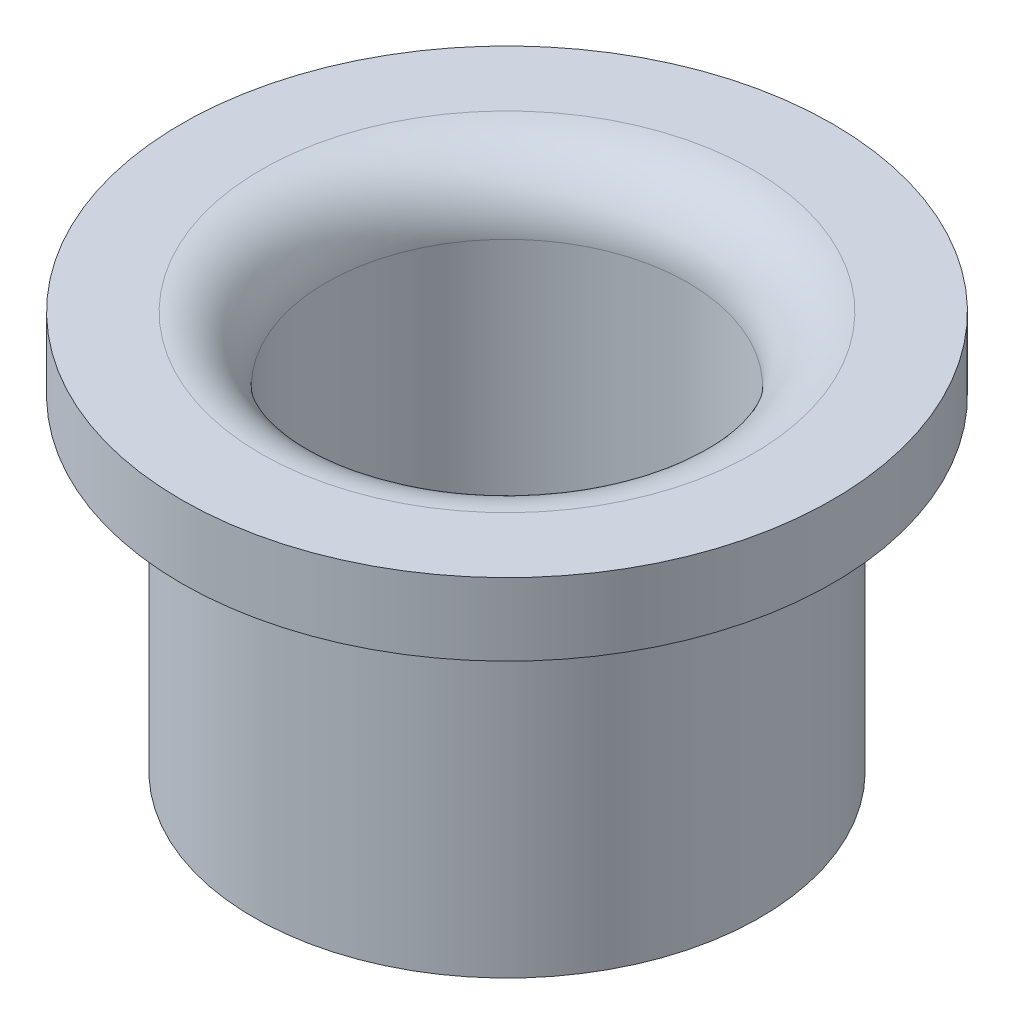
ISO-10303-21;
HEADER;
FILE_DESCRIPTION(('STEP AP214'),'2;1');
FILE_NAME('part.step','',(''),(''),'','','');
FILE_SCHEMA(('AUTOMOTIVE_DESIGN { 1 0 10303 214 1 1 1 1 }'));
ENDSEC;
DATA;
#1=APPLICATION_CONTEXT('core data for automotive mechanical design processes');
#2=APPLICATION_PROTOCOL_DEFINITION('international standard','automotive_design',2000,#1);
#3=PRODUCT_CONTEXT('',#1,'mechanical');
#4=PRODUCT('Part','Part','',(#3));
#5=PRODUCT_RELATED_PRODUCT_CATEGORY('part','',(#4));
#6=PRODUCT_DEFINITION_FORMATION('','',#4);
#7=PRODUCT_DEFINITION_CONTEXT('part definition',#1,'design');
#8=PRODUCT_DEFINITION('design','',#6,#7);
#9=PRODUCT_DEFINITION_SHAPE('','',#8);
#10=(LENGTH_UNIT() NAMED_UNIT(*) SI_UNIT(.MILLI.,.METRE.));
#11=(NAMED_UNIT(*) PLANE_ANGLE_UNIT() SI_UNIT($,.RADIAN.));
#12=(NAMED_UNIT(*) SI_UNIT($,.STERADIAN.) SOLID_ANGLE_UNIT());
#13=UNCERTAINTY_MEASURE_WITH_UNIT(LENGTH_MEASURE(1.E-05),#10,'distance_accuracy_value','');
#14=(GEOMETRIC_REPRESENTATION_CONTEXT(3) GLOBAL_UNCERTAINTY_ASSIGNED_CONTEXT((#13)) GLOBAL_UNIT_ASSIGNED_CONTEXT((#10,
#11,#12)) REPRESENTATION_CONTEXT('',''));
#15=CARTESIAN_POINT('',(0.,0.,0.));
#16=DIRECTION('',(0.,0.,1.));
#17=DIRECTION('',(1.,0.,0.));
#18=AXIS2_PLACEMENT_3D('',#15,#16,#17);
#19=CARTESIAN_POINT('',(6.99999999999856,0.,-4.44089209850063E-13));
#20=DIRECTION('',(0.,-1.,0.));
#21=DIRECTION('',(0.,0.,-0.999999999999998));
#22=AXIS2_PLACEMENT_3D('',#19,#20,#21);
#23=PLANE('',#22);
#24=CARTESIAN_POINT('',(0.,0.,0.));
#25=DIRECTION('',(0.,-1.,0.));
#26=DIRECTION('',(0.,0.,-0.999999999999998));
#27=AXIS2_PLACEMENT_3D('',#24,#25,#26);
#28=CIRCLE('',#27,7.);
#29=CARTESIAN_POINT('',(0.,0.,-6.99999999999999));
#30=VERTEX_POINT('',#29);
#31=EDGE_CURVE('E61',#30,#30,#28,.T.);
#32=ORIENTED_EDGE('',*,*,#31,.T.);
#33=EDGE_LOOP('',(#32));
#34=FACE_BOUND('',#33,.T.);
#35=CARTESIAN_POINT('',(0.,0.,0.));
#36=DIRECTION('',(0.,-1.,0.));
#37=DIRECTION('',(0.,0.,-0.999999999999998));
#38=AXIS2_PLACEMENT_3D('',#35,#36,#37);
#39=CIRCLE('',#38,5.);
#40=CARTESIAN_POINT('',(0.,0.,-4.99999999999999));
#41=VERTEX_POINT('',#40);
#42=EDGE_CURVE('E10',#41,#41,#39,.T.);
#43=ORIENTED_EDGE('',*,*,#42,.F.);
#44=EDGE_LOOP('',(#43));
#45=FACE_BOUND('',#44,.T.);
#46=ADVANCED_FACE('F33',(#34,#45),#23,.T.);
#47=CARTESIAN_POINT('',(0.,0.,0.));
#48=DIRECTION('',(0.,-1.,0.));
#49=DIRECTION('',(0.,0.,-0.999999999999998));
#50=AXIS2_PLACEMENT_3D('',#47,#48,#49);
#51=CYLINDRICAL_SURFACE('',#50,5.);
#52=ORIENTED_EDGE('',*,*,#42,.T.);
#53=EDGE_LOOP('',(#52));
#54=FACE_BOUND('',#53,.T.);
#55=CARTESIAN_POINT('',(-8.88178419700125E-13,9.19999999999999,0.));
#56=DIRECTION('',(0.,-1.,0.));
#57=DIRECTION('',(0.,0.,-0.999999999999998));
#58=AXIS2_PLACEMENT_3D('',#55,#56,#57);
#59=CIRCLE('',#58,5.);
#60=CARTESIAN_POINT('',(-8.81239525796218E-13,9.19999999999999,-4.99999999999999));
#61=VERTEX_POINT('',#60);
#62=EDGE_CURVE('E39',#61,#61,#59,.T.);
#63=ORIENTED_EDGE('',*,*,#62,.F.);
#64=EDGE_LOOP('',(#63));
#65=FACE_BOUND('',#64,.T.);
#66=ADVANCED_FACE('F79',(#54,#65),#51,.F.);
#67=CARTESIAN_POINT('',(-8.88178419700125E-13,9.19999999999999,0.));
#68=DIRECTION('',(0.,-1.,0.));
#69=DIRECTION('',(0.,0.,-0.999999999999998));
#70=AXIS2_PLACEMENT_3D('',#67,#68,#69);
#71=TOROIDAL_SURFACE('',#70,6.8,1.8);
#72=ORIENTED_EDGE('',*,*,#62,.T.);
#73=EDGE_LOOP('',(#72));
#74=FACE_BOUND('',#73,.T.);
#75=CARTESIAN_POINT('',(0.,10.9999999999989,0.));
#76=DIRECTION('',(0.,-1.,0.));
#77=DIRECTION('',(0.,0.,-0.999999999999998));
#78=AXIS2_PLACEMENT_3D('',#75,#76,#77);
#79=CIRCLE('',#78,6.80000000000001);
#80=CARTESIAN_POINT('',(0.,10.9999999999989,-6.8));
#81=VERTEX_POINT('',#80);
#82=EDGE_CURVE('E43',#81,#81,#79,.T.);
#83=ORIENTED_EDGE('',*,*,#82,.F.);
#84=EDGE_LOOP('',(#83));
#85=FACE_BOUND('',#84,.T.);
#86=ADVANCED_FACE('F83',(#74,#85),#71,.T.);
#87=CARTESIAN_POINT('',(6.79999999999659,10.9999999999989,0.));
#88=DIRECTION('',(0.,1.,0.));
#89=DIRECTION('',(0.,0.,0.999999999999998));
#90=AXIS2_PLACEMENT_3D('',#87,#88,#89);
#91=PLANE('',#90);
#92=ORIENTED_EDGE('',*,*,#82,.T.);
#93=EDGE_LOOP('',(#92));
#94=FACE_BOUND('',#93,.T.);
#95=CARTESIAN_POINT('',(0.,10.9999999999989,0.));
#96=DIRECTION('',(0.,-1.,0.));
#97=DIRECTION('',(0.,0.,-0.999999999999998));
#98=AXIS2_PLACEMENT_3D('',#95,#96,#97);
#99=CIRCLE('',#98,9.);
#100=CARTESIAN_POINT('',(0.,10.9999999999989,-8.99999999999998));
#101=VERTEX_POINT('',#100);
#102=EDGE_CURVE('E47',#101,#101,#99,.T.);
#103=ORIENTED_EDGE('',*,*,#102,.F.);
#104=EDGE_LOOP('',(#103));
#105=FACE_BOUND('',#104,.T.);
#106=ADVANCED_FACE('F87',(#94,#105),#91,.T.);
#107=CARTESIAN_POINT('',(0.,0.,0.));
#108=DIRECTION('',(0.,-1.,0.));
#109=DIRECTION('',(0.,0.,-0.999999999999998));
#110=AXIS2_PLACEMENT_3D('',#107,#108,#109);
#111=CYLINDRICAL_SURFACE('',#110,9.);
#112=ORIENTED_EDGE('',*,*,#102,.T.);
#113=EDGE_LOOP('',(#112));
#114=FACE_BOUND('',#113,.T.);
#115=CARTESIAN_POINT('',(-1.77635683940025E-12,9.00000000000001,0.));
#116=DIRECTION('',(0.,-1.,0.));
#117=DIRECTION('',(0.,0.,-0.999999999999998));
#118=AXIS2_PLACEMENT_3D('',#115,#116,#117);
#119=CIRCLE('',#118,9.);
#120=CARTESIAN_POINT('',(-1.76386683037322E-12,9.00000000000001,-8.99999999999998));
#121=VERTEX_POINT('',#120);
#122=EDGE_CURVE('E52',#121,#121,#119,.T.);
#123=ORIENTED_EDGE('',*,*,#122,.F.);
#124=EDGE_LOOP('',(#123));
#125=FACE_BOUND('',#124,.T.);
#126=ADVANCED_FACE('F93',(#114,#125),#111,.T.);
#127=CARTESIAN_POINT('',(8.9999999999959,8.9999999999989,0.));
#128=DIRECTION('',(0.,-1.,0.));
#129=DIRECTION('',(0.,0.,-0.999999999999998));
#130=AXIS2_PLACEMENT_3D('',#127,#128,#129);
#131=PLANE('',#130);
#132=ORIENTED_EDGE('',*,*,#122,.T.);
#133=EDGE_LOOP('',(#132));
#134=FACE_BOUND('',#133,.T.);
#135=CARTESIAN_POINT('',(-1.77635683940025E-12,9.00000000000001,0.));
#136=DIRECTION('',(0.,-1.,0.));
#137=DIRECTION('',(0.,0.,-0.999999999999998));
#138=AXIS2_PLACEMENT_3D('',#135,#136,#137);
#139=CIRCLE('',#138,7.80000000000001);
#140=CARTESIAN_POINT('',(-1.76553216491016E-12,9.00000000000001,-7.79999999999999));
#141=VERTEX_POINT('',#140);
#142=EDGE_CURVE('E55',#141,#141,#139,.T.);
#143=ORIENTED_EDGE('',*,*,#142,.F.);
#144=EDGE_LOOP('',(#143));
#145=FACE_BOUND('',#144,.T.);
#146=ADVANCED_FACE('F75',(#134,#145),#131,.T.);
#147=CARTESIAN_POINT('',(0.,8.19999999999899,0.));
#148=DIRECTION('',(0.,-1.,0.));
#149=DIRECTION('',(0.,0.,-0.999999999999998));
#150=AXIS2_PLACEMENT_3D('',#147,#148,#149);
#151=TOROIDAL_SURFACE('',#150,7.8,0.8);
#152=ORIENTED_EDGE('',*,*,#142,.T.);
#153=EDGE_LOOP('',(#152));
#154=FACE_BOUND('',#153,.T.);
#155=CARTESIAN_POINT('',(0.,8.19999999999899,0.));
#156=DIRECTION('',(0.,-1.,0.));
#157=DIRECTION('',(0.,0.,-0.999999999999998));
#158=AXIS2_PLACEMENT_3D('',#155,#156,#157);
#159=CIRCLE('',#158,7.);
#160=CARTESIAN_POINT('',(0.,8.19999999999899,-6.99999999999999));
#161=VERTEX_POINT('',#160);
#162=EDGE_CURVE('E58',#161,#161,#159,.T.);
#163=ORIENTED_EDGE('',*,*,#162,.F.);
#164=EDGE_LOOP('',(#163));
#165=FACE_BOUND('',#164,.T.);
#166=ADVANCED_FACE('F69',(#154,#165),#151,.F.);
#167=CARTESIAN_POINT('',(0.,0.,0.));
#168=DIRECTION('',(0.,-1.,0.));
#169=DIRECTION('',(0.,0.,-0.999999999999998));
#170=AXIS2_PLACEMENT_3D('',#167,#168,#169);
#171=CYLINDRICAL_SURFACE('',#170,7.);
#172=ORIENTED_EDGE('',*,*,#162,.T.);
#173=EDGE_LOOP('',(#172));
#174=FACE_BOUND('',#173,.T.);
#175=ORIENTED_EDGE('',*,*,#31,.F.);
#176=EDGE_LOOP('',(#175));
#177=FACE_BOUND('',#176,.T.);
#178=ADVANCED_FACE('F67',(#174,#177),#171,.T.);
#179=CLOSED_SHELL('',(#46,#66,#86,#106,#126,#146,#166,#178));
#180=MANIFOLD_SOLID_BREP('B2',#179);
#181=ADVANCED_BREP_SHAPE_REPRESENTATION('',(#18,#180),#14);
#182=SHAPE_DEFINITION_REPRESENTATION(#9,#181);
ENDSEC;
END-ISO-10303-21;
